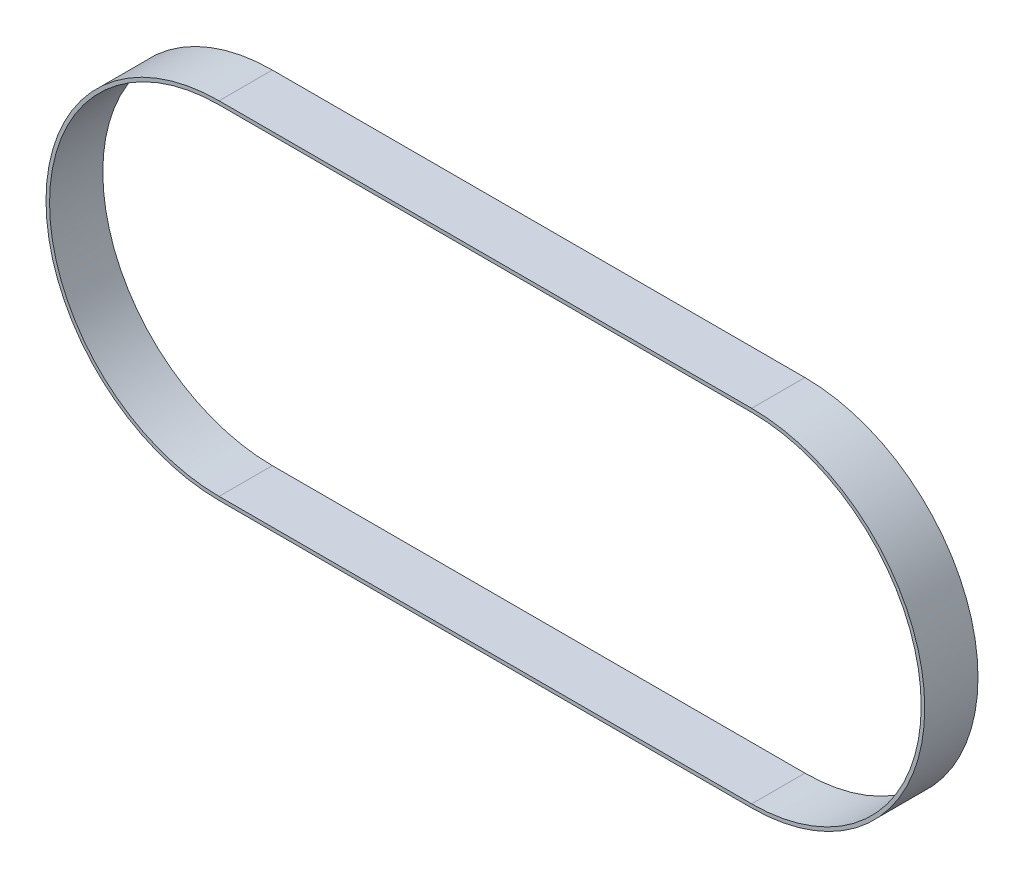
ISO-10303-21;
HEADER;
FILE_DESCRIPTION(('STEP AP214'),'2;1');
FILE_NAME('part.step','',(''),(''),'','','');
FILE_SCHEMA(('AUTOMOTIVE_DESIGN { 1 0 10303 214 1 1 1 1 }'));
ENDSEC;
DATA;
#1=APPLICATION_CONTEXT('core data for automotive mechanical design processes');
#2=APPLICATION_PROTOCOL_DEFINITION('international standard','automotive_design',2000,#1);
#3=PRODUCT_CONTEXT('',#1,'mechanical');
#4=PRODUCT('Part','Part','',(#3));
#5=PRODUCT_RELATED_PRODUCT_CATEGORY('part','',(#4));
#6=PRODUCT_DEFINITION_FORMATION('','',#4);
#7=PRODUCT_DEFINITION_CONTEXT('part definition',#1,'design');
#8=PRODUCT_DEFINITION('design','',#6,#7);
#9=PRODUCT_DEFINITION_SHAPE('','',#8);
#10=(LENGTH_UNIT() NAMED_UNIT(*) SI_UNIT(.MILLI.,.METRE.));
#11=(NAMED_UNIT(*) PLANE_ANGLE_UNIT() SI_UNIT($,.RADIAN.));
#12=(NAMED_UNIT(*) SI_UNIT($,.STERADIAN.) SOLID_ANGLE_UNIT());
#13=UNCERTAINTY_MEASURE_WITH_UNIT(LENGTH_MEASURE(1.E-05),#10,'distance_accuracy_value','');
#14=(GEOMETRIC_REPRESENTATION_CONTEXT(3) GLOBAL_UNCERTAINTY_ASSIGNED_CONTEXT((#13)) GLOBAL_UNIT_ASSIGNED_CONTEXT((#10,
#11,#12)) REPRESENTATION_CONTEXT('',''));
#15=CARTESIAN_POINT('',(0.,0.,0.));
#16=DIRECTION('',(0.,0.,1.));
#17=DIRECTION('',(1.,0.,0.));
#18=AXIS2_PLACEMENT_3D('',#15,#16,#17);
#19=CARTESIAN_POINT('',(-75.,0.,15.));
#20=DIRECTION('',(0.,0.,1.));
#21=DIRECTION('',(1.,0.,0.));
#22=AXIS2_PLACEMENT_3D('',#19,#20,#21);
#23=PLANE('',#22);
#24=CARTESIAN_POINT('',(-75.,0.,15.));
#25=DIRECTION('',(0.,0.,1.));
#26=DIRECTION('',(1.,0.,0.));
#27=AXIS2_PLACEMENT_3D('',#24,#25,#26);
#28=CIRCLE('',#27,48.7464829275686);
#29=CARTESIAN_POINT('',(-75.,48.7464829275686,15.));
#30=VERTEX_POINT('',#29);
#31=CARTESIAN_POINT('',(-75.,-48.7464829275686,15.));
#32=VERTEX_POINT('',#31);
#33=EDGE_CURVE('E135',#30,#32,#28,.T.);
#34=ORIENTED_EDGE('',*,*,#33,.T.);
#35=DIRECTION('',(1.,0.,0.));
#36=VECTOR('',#35,1.);
#37=CARTESIAN_POINT('',(-75.,-48.7464829275686,15.));
#38=LINE('',#37,#36);
#39=CARTESIAN_POINT('',(75.,-48.7464829275686,15.));
#40=VERTEX_POINT('',#39);
#41=EDGE_CURVE('E138',#32,#40,#38,.T.);
#42=ORIENTED_EDGE('',*,*,#41,.T.);
#43=CARTESIAN_POINT('',(75.,0.,15.));
#44=DIRECTION('',(0.,0.,1.));
#45=DIRECTION('',(1.,0.,0.));
#46=AXIS2_PLACEMENT_3D('',#43,#44,#45);
#47=CIRCLE('',#46,48.7464829275686);
#48=CARTESIAN_POINT('',(75.,48.7464829275686,15.));
#49=VERTEX_POINT('',#48);
#50=EDGE_CURVE('E141',#40,#49,#47,.T.);
#51=ORIENTED_EDGE('',*,*,#50,.T.);
#52=DIRECTION('',(-1.,0.,0.));
#53=VECTOR('',#52,1.);
#54=CARTESIAN_POINT('',(-75.,48.7464829275686,15.));
#55=LINE('',#54,#53);
#56=EDGE_CURVE('E143',#49,#30,#55,.T.);
#57=ORIENTED_EDGE('',*,*,#56,.T.);
#58=EDGE_LOOP('',(#34,#42,#51,#57));
#59=FACE_BOUND('',#58,.T.);
#60=DIRECTION('',(1.,0.,0.));
#61=VECTOR('',#60,1.);
#62=CARTESIAN_POINT('',(-75.,-47.7464829275686,15.));
#63=LINE('',#62,#61);
#64=CARTESIAN_POINT('',(-75.,-47.7464829275686,15.));
#65=VERTEX_POINT('',#64);
#66=CARTESIAN_POINT('',(75.,-47.7464829275686,15.));
#67=VERTEX_POINT('',#66);
#68=EDGE_CURVE('E107',#65,#67,#63,.T.);
#69=ORIENTED_EDGE('',*,*,#68,.F.);
#70=CARTESIAN_POINT('',(-75.,0.,15.));
#71=DIRECTION('',(0.,0.,1.));
#72=DIRECTION('',(1.,0.,0.));
#73=AXIS2_PLACEMENT_3D('',#70,#71,#72);
#74=CIRCLE('',#73,47.7464829275686);
#75=CARTESIAN_POINT('',(-75.,47.7464829275686,15.));
#76=VERTEX_POINT('',#75);
#77=EDGE_CURVE('E99',#76,#65,#74,.T.);
#78=ORIENTED_EDGE('',*,*,#77,.F.);
#79=DIRECTION('',(-1.,0.,0.));
#80=VECTOR('',#79,1.);
#81=CARTESIAN_POINT('',(-75.,47.7464829275686,15.));
#82=LINE('',#81,#80);
#83=CARTESIAN_POINT('',(75.,47.7464829275686,15.));
#84=VERTEX_POINT('',#83);
#85=EDGE_CURVE('E121',#84,#76,#82,.T.);
#86=ORIENTED_EDGE('',*,*,#85,.F.);
#87=CARTESIAN_POINT('',(75.,0.,15.));
#88=DIRECTION('',(0.,0.,1.));
#89=DIRECTION('',(1.,0.,0.));
#90=AXIS2_PLACEMENT_3D('',#87,#88,#89);
#91=CIRCLE('',#90,47.7464829275686);
#92=EDGE_CURVE('E119',#67,#84,#91,.T.);
#93=ORIENTED_EDGE('',*,*,#92,.F.);
#94=EDGE_LOOP('',(#69,#78,#86,#93));
#95=FACE_BOUND('',#94,.T.);
#96=ADVANCED_FACE('F34',(#59,#95),#23,.T.);
#97=CARTESIAN_POINT('',(-75.,0.,0.));
#98=DIRECTION('',(0.,0.,1.));
#99=DIRECTION('',(1.,0.,0.));
#100=AXIS2_PLACEMENT_3D('',#97,#98,#99);
#101=PLANE('',#100);
#102=CARTESIAN_POINT('',(-75.,0.,0.));
#103=DIRECTION('',(0.,0.,1.));
#104=DIRECTION('',(1.,0.,0.));
#105=AXIS2_PLACEMENT_3D('',#102,#103,#104);
#106=CIRCLE('',#105,48.7464829275686);
#107=CARTESIAN_POINT('',(-75.,48.7464829275686,0.));
#108=VERTEX_POINT('',#107);
#109=CARTESIAN_POINT('',(-75.,-48.7464829275686,0.));
#110=VERTEX_POINT('',#109);
#111=EDGE_CURVE('E115',#108,#110,#106,.T.);
#112=ORIENTED_EDGE('',*,*,#111,.F.);
#113=DIRECTION('',(-1.,0.,0.));
#114=VECTOR('',#113,1.);
#115=CARTESIAN_POINT('',(-75.,48.7464829275686,0.));
#116=LINE('',#115,#114);
#117=CARTESIAN_POINT('',(75.,48.7464829275686,0.));
#118=VERTEX_POINT('',#117);
#119=EDGE_CURVE('E139',#118,#108,#116,.T.);
#120=ORIENTED_EDGE('',*,*,#119,.F.);
#121=CARTESIAN_POINT('',(75.,0.,0.));
#122=DIRECTION('',(0.,0.,1.));
#123=DIRECTION('',(1.,0.,0.));
#124=AXIS2_PLACEMENT_3D('',#121,#122,#123);
#125=CIRCLE('',#124,48.7464829275686);
#126=CARTESIAN_POINT('',(75.,-48.7464829275686,0.));
#127=VERTEX_POINT('',#126);
#128=EDGE_CURVE('E150',#127,#118,#125,.T.);
#129=ORIENTED_EDGE('',*,*,#128,.F.);
#130=DIRECTION('',(1.,0.,0.));
#131=VECTOR('',#130,1.);
#132=CARTESIAN_POINT('',(-75.,-48.7464829275686,0.));
#133=LINE('',#132,#131);
#134=EDGE_CURVE('E148',#110,#127,#133,.T.);
#135=ORIENTED_EDGE('',*,*,#134,.F.);
#136=EDGE_LOOP('',(#112,#120,#129,#135));
#137=FACE_BOUND('',#136,.T.);
#138=CARTESIAN_POINT('',(-75.,0.,0.));
#139=DIRECTION('',(0.,0.,1.));
#140=DIRECTION('',(1.,0.,0.));
#141=AXIS2_PLACEMENT_3D('',#138,#139,#140);
#142=CIRCLE('',#141,47.7464829275686);
#143=CARTESIAN_POINT('',(-75.,47.7464829275686,0.));
#144=VERTEX_POINT('',#143);
#145=CARTESIAN_POINT('',(-75.,-47.7464829275686,0.));
#146=VERTEX_POINT('',#145);
#147=EDGE_CURVE('E57',#144,#146,#142,.T.);
#148=ORIENTED_EDGE('',*,*,#147,.T.);
#149=DIRECTION('',(1.,0.,0.));
#150=VECTOR('',#149,1.);
#151=CARTESIAN_POINT('',(-75.,-47.7464829275686,0.));
#152=LINE('',#151,#150);
#153=CARTESIAN_POINT('',(75.,-47.7464829275686,0.));
#154=VERTEX_POINT('',#153);
#155=EDGE_CURVE('E114',#146,#154,#152,.T.);
#156=ORIENTED_EDGE('',*,*,#155,.T.);
#157=CARTESIAN_POINT('',(75.,0.,0.));
#158=DIRECTION('',(0.,0.,1.));
#159=DIRECTION('',(1.,0.,0.));
#160=AXIS2_PLACEMENT_3D('',#157,#158,#159);
#161=CIRCLE('',#160,47.7464829275686);
#162=CARTESIAN_POINT('',(75.,47.7464829275686,0.));
#163=VERTEX_POINT('',#162);
#164=EDGE_CURVE('E127',#154,#163,#161,.T.);
#165=ORIENTED_EDGE('',*,*,#164,.T.);
#166=DIRECTION('',(-1.,0.,0.));
#167=VECTOR('',#166,1.);
#168=CARTESIAN_POINT('',(-75.,47.7464829275686,0.));
#169=LINE('',#168,#167);
#170=EDGE_CURVE('E108',#163,#144,#169,.T.);
#171=ORIENTED_EDGE('',*,*,#170,.T.);
#172=EDGE_LOOP('',(#148,#156,#165,#171));
#173=FACE_BOUND('',#172,.T.);
#174=ADVANCED_FACE('F168',(#137,#173),#101,.F.);
#175=CARTESIAN_POINT('',(-75.,0.,15.));
#176=DIRECTION('',(0.,0.,-1.));
#177=DIRECTION('',(-1.,0.,0.));
#178=AXIS2_PLACEMENT_3D('',#175,#176,#177);
#179=CYLINDRICAL_SURFACE('',#178,48.7464829275686);
#180=ORIENTED_EDGE('',*,*,#111,.T.);
#181=DIRECTION('',(0.,0.,-1.));
#182=VECTOR('',#181,1.);
#183=CARTESIAN_POINT('',(-75.,-48.7464829275686,15.));
#184=LINE('',#183,#182);
#185=EDGE_CURVE('E11',#32,#110,#184,.T.);
#186=ORIENTED_EDGE('',*,*,#185,.F.);
#187=ORIENTED_EDGE('',*,*,#33,.F.);
#188=DIRECTION('',(0.,0.,-1.));
#189=VECTOR('',#188,1.);
#190=CARTESIAN_POINT('',(-75.,48.7464829275686,15.));
#191=LINE('',#190,#189);
#192=EDGE_CURVE('E145',#30,#108,#191,.T.);
#193=ORIENTED_EDGE('',*,*,#192,.T.);
#194=EDGE_LOOP('',(#180,#186,#187,#193));
#195=FACE_BOUND('',#194,.T.);
#196=ADVANCED_FACE('F36',(#195),#179,.T.);
#197=CARTESIAN_POINT('',(-75.,-48.7464829275686,15.));
#198=DIRECTION('',(0.,1.,0.));
#199=DIRECTION('',(0.,0.,1.));
#200=AXIS2_PLACEMENT_3D('',#197,#198,#199);
#201=PLANE('',#200);
#202=ORIENTED_EDGE('',*,*,#134,.T.);
#203=DIRECTION('',(0.,0.,-1.));
#204=VECTOR('',#203,1.);
#205=CARTESIAN_POINT('',(75.,-48.7464829275686,15.));
#206=LINE('',#205,#204);
#207=EDGE_CURVE('E42',#40,#127,#206,.T.);
#208=ORIENTED_EDGE('',*,*,#207,.F.);
#209=ORIENTED_EDGE('',*,*,#41,.F.);
#210=ORIENTED_EDGE('',*,*,#185,.T.);
#211=EDGE_LOOP('',(#202,#208,#209,#210));
#212=FACE_BOUND('',#211,.T.);
#213=ADVANCED_FACE('F178',(#212),#201,.F.);
#214=CARTESIAN_POINT('',(75.,0.,15.));
#215=DIRECTION('',(0.,0.,-1.));
#216=DIRECTION('',(-1.,0.,0.));
#217=AXIS2_PLACEMENT_3D('',#214,#215,#216);
#218=CYLINDRICAL_SURFACE('',#217,48.7464829275686);
#219=ORIENTED_EDGE('',*,*,#128,.T.);
#220=DIRECTION('',(0.,0.,-1.));
#221=VECTOR('',#220,1.);
#222=CARTESIAN_POINT('',(75.,48.7464829275686,15.));
#223=LINE('',#222,#221);
#224=EDGE_CURVE('E155',#49,#118,#223,.T.);
#225=ORIENTED_EDGE('',*,*,#224,.F.);
#226=ORIENTED_EDGE('',*,*,#50,.F.);
#227=ORIENTED_EDGE('',*,*,#207,.T.);
#228=EDGE_LOOP('',(#219,#225,#226,#227));
#229=FACE_BOUND('',#228,.T.);
#230=ADVANCED_FACE('F162',(#229),#218,.T.);
#231=CARTESIAN_POINT('',(-75.,48.7464829275686,15.));
#232=DIRECTION('',(0.,-1.,0.));
#233=DIRECTION('',(1.,0.,0.));
#234=AXIS2_PLACEMENT_3D('',#231,#232,#233);
#235=PLANE('',#234);
#236=ORIENTED_EDGE('',*,*,#119,.T.);
#237=ORIENTED_EDGE('',*,*,#192,.F.);
#238=ORIENTED_EDGE('',*,*,#56,.F.);
#239=ORIENTED_EDGE('',*,*,#224,.T.);
#240=EDGE_LOOP('',(#236,#237,#238,#239));
#241=FACE_BOUND('',#240,.T.);
#242=ADVANCED_FACE('F172',(#241),#235,.F.);
#243=CARTESIAN_POINT('',(-75.,0.,15.));
#244=DIRECTION('',(0.,0.,-1.));
#245=DIRECTION('',(-1.,0.,0.));
#246=AXIS2_PLACEMENT_3D('',#243,#244,#245);
#247=CYLINDRICAL_SURFACE('',#246,47.7464829275686);
#248=ORIENTED_EDGE('',*,*,#147,.F.);
#249=DIRECTION('',(0.,0.,-1.));
#250=VECTOR('',#249,1.);
#251=CARTESIAN_POINT('',(-75.,47.7464829275686,15.));
#252=LINE('',#251,#250);
#253=EDGE_CURVE('E103',#76,#144,#252,.T.);
#254=ORIENTED_EDGE('',*,*,#253,.F.);
#255=ORIENTED_EDGE('',*,*,#77,.T.);
#256=DIRECTION('',(0.,0.,-1.));
#257=VECTOR('',#256,1.);
#258=CARTESIAN_POINT('',(-75.,-47.7464829275686,15.));
#259=LINE('',#258,#257);
#260=EDGE_CURVE('E102',#65,#146,#259,.T.);
#261=ORIENTED_EDGE('',*,*,#260,.T.);
#262=EDGE_LOOP('',(#248,#254,#255,#261));
#263=FACE_BOUND('',#262,.T.);
#264=ADVANCED_FACE('F101',(#263),#247,.F.);
#265=CARTESIAN_POINT('',(-75.,-47.7464829275686,15.));
#266=DIRECTION('',(0.,1.,0.));
#267=DIRECTION('',(0.,0.,1.));
#268=AXIS2_PLACEMENT_3D('',#265,#266,#267);
#269=PLANE('',#268);
#270=ORIENTED_EDGE('',*,*,#155,.F.);
#271=ORIENTED_EDGE('',*,*,#260,.F.);
#272=ORIENTED_EDGE('',*,*,#68,.T.);
#273=DIRECTION('',(0.,0.,-1.));
#274=VECTOR('',#273,1.);
#275=CARTESIAN_POINT('',(75.,-47.7464829275686,15.));
#276=LINE('',#275,#274);
#277=EDGE_CURVE('E116',#67,#154,#276,.T.);
#278=ORIENTED_EDGE('',*,*,#277,.T.);
#279=EDGE_LOOP('',(#270,#271,#272,#278));
#280=FACE_BOUND('',#279,.T.);
#281=ADVANCED_FACE('F111',(#280),#269,.T.);
#282=CARTESIAN_POINT('',(75.,0.,15.));
#283=DIRECTION('',(0.,0.,-1.));
#284=DIRECTION('',(-1.,0.,0.));
#285=AXIS2_PLACEMENT_3D('',#282,#283,#284);
#286=CYLINDRICAL_SURFACE('',#285,47.7464829275686);
#287=ORIENTED_EDGE('',*,*,#164,.F.);
#288=ORIENTED_EDGE('',*,*,#277,.F.);
#289=ORIENTED_EDGE('',*,*,#92,.T.);
#290=DIRECTION('',(0.,0.,-1.));
#291=VECTOR('',#290,1.);
#292=CARTESIAN_POINT('',(75.,47.7464829275686,15.));
#293=LINE('',#292,#291);
#294=EDGE_CURVE('E49',#84,#163,#293,.T.);
#295=ORIENTED_EDGE('',*,*,#294,.T.);
#296=EDGE_LOOP('',(#287,#288,#289,#295));
#297=FACE_BOUND('',#296,.T.);
#298=ADVANCED_FACE('F201',(#297),#286,.F.);
#299=CARTESIAN_POINT('',(-75.,47.7464829275686,15.));
#300=DIRECTION('',(0.,-1.,0.));
#301=DIRECTION('',(0.,0.,-1.));
#302=AXIS2_PLACEMENT_3D('',#299,#300,#301);
#303=PLANE('',#302);
#304=ORIENTED_EDGE('',*,*,#170,.F.);
#305=ORIENTED_EDGE('',*,*,#294,.F.);
#306=ORIENTED_EDGE('',*,*,#85,.T.);
#307=ORIENTED_EDGE('',*,*,#253,.T.);
#308=EDGE_LOOP('',(#304,#305,#306,#307));
#309=FACE_BOUND('',#308,.T.);
#310=ADVANCED_FACE('F205',(#309),#303,.T.);
#311=CLOSED_SHELL('',(#96,#174,#196,#213,#230,#242,#264,#281,#298,#310));
#312=MANIFOLD_SOLID_BREP('B2',#311);
#313=ADVANCED_BREP_SHAPE_REPRESENTATION('',(#18,#312),#14);
#314=SHAPE_DEFINITION_REPRESENTATION(#9,#313);
ENDSEC;
END-ISO-10303-21;
